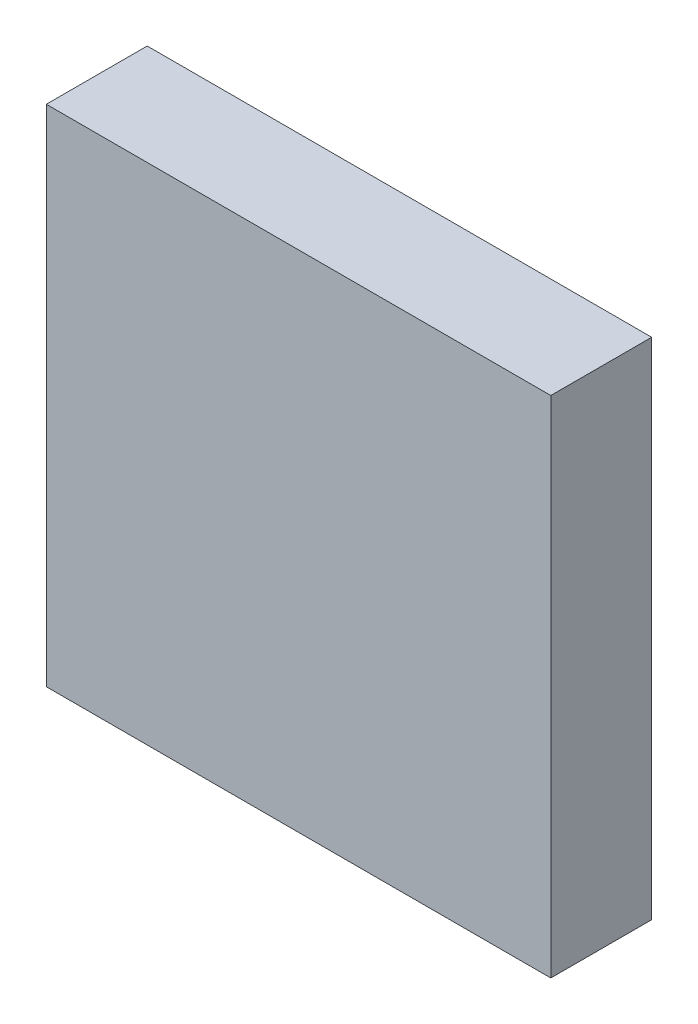
ISO-10303-21;
HEADER;
FILE_DESCRIPTION(('STEP AP214'),'2;1');
FILE_NAME('part.step','',(''),(''),'','','');
FILE_SCHEMA(('AUTOMOTIVE_DESIGN { 1 0 10303 214 1 1 1 1 }'));
ENDSEC;
DATA;
#1=APPLICATION_CONTEXT('core data for automotive mechanical design processes');
#2=APPLICATION_PROTOCOL_DEFINITION('international standard','automotive_design',2000,#1);
#3=PRODUCT_CONTEXT('',#1,'mechanical');
#4=PRODUCT('Part','Part','',(#3));
#5=PRODUCT_RELATED_PRODUCT_CATEGORY('part','',(#4));
#6=PRODUCT_DEFINITION_FORMATION('','',#4);
#7=PRODUCT_DEFINITION_CONTEXT('part definition',#1,'design');
#8=PRODUCT_DEFINITION('design','',#6,#7);
#9=PRODUCT_DEFINITION_SHAPE('','',#8);
#10=(LENGTH_UNIT() NAMED_UNIT(*) SI_UNIT(.MILLI.,.METRE.));
#11=(NAMED_UNIT(*) PLANE_ANGLE_UNIT() SI_UNIT($,.RADIAN.));
#12=(NAMED_UNIT(*) SI_UNIT($,.STERADIAN.) SOLID_ANGLE_UNIT());
#13=UNCERTAINTY_MEASURE_WITH_UNIT(LENGTH_MEASURE(1.E-05),#10,'distance_accuracy_value','');
#14=(GEOMETRIC_REPRESENTATION_CONTEXT(3) GLOBAL_UNCERTAINTY_ASSIGNED_CONTEXT((#13)) GLOBAL_UNIT_ASSIGNED_CONTEXT((#10,
#11,#12)) REPRESENTATION_CONTEXT('',''));
#15=CARTESIAN_POINT('',(0.,0.,0.));
#16=DIRECTION('',(0.,0.,1.));
#17=DIRECTION('',(1.,0.,0.));
#18=AXIS2_PLACEMENT_3D('',#15,#16,#17);
#19=CARTESIAN_POINT('',(0.,0.,5.));
#20=DIRECTION('',(1.,0.,0.));
#21=DIRECTION('',(0.,0.,-1.));
#22=AXIS2_PLACEMENT_3D('',#19,#20,#21);
#23=PLANE('',#22);
#24=DIRECTION('',(0.,-1.,0.));
#25=VECTOR('',#24,1.);
#26=CARTESIAN_POINT('',(0.,0.,0.));
#27=LINE('',#26,#25);
#28=CARTESIAN_POINT('',(0.,0.,0.));
#29=VERTEX_POINT('',#28);
#30=CARTESIAN_POINT('',(0.,-25.,0.));
#31=VERTEX_POINT('',#30);
#32=EDGE_CURVE('E96',#29,#31,#27,.T.);
#33=ORIENTED_EDGE('',*,*,#32,.T.);
#34=DIRECTION('',(0.,0.,-1.));
#35=VECTOR('',#34,1.);
#36=CARTESIAN_POINT('',(0.,-25.,5.));
#37=LINE('',#36,#35);
#38=CARTESIAN_POINT('',(0.,-25.,5.));
#39=VERTEX_POINT('',#38);
#40=EDGE_CURVE('E11',#39,#31,#37,.T.);
#41=ORIENTED_EDGE('',*,*,#40,.F.);
#42=DIRECTION('',(0.,-1.,0.));
#43=VECTOR('',#42,1.);
#44=CARTESIAN_POINT('',(0.,0.,5.));
#45=LINE('',#44,#43);
#46=CARTESIAN_POINT('',(0.,0.,5.));
#47=VERTEX_POINT('',#46);
#48=EDGE_CURVE('E84',#47,#39,#45,.T.);
#49=ORIENTED_EDGE('',*,*,#48,.F.);
#50=DIRECTION('',(0.,0.,-1.));
#51=VECTOR('',#50,1.);
#52=CARTESIAN_POINT('',(0.,0.,5.));
#53=LINE('',#52,#51);
#54=EDGE_CURVE('E92',#47,#29,#53,.T.);
#55=ORIENTED_EDGE('',*,*,#54,.T.);
#56=EDGE_LOOP('',(#33,#41,#49,#55));
#57=FACE_BOUND('',#56,.T.);
#58=ADVANCED_FACE('F33',(#57),#23,.F.);
#59=CARTESIAN_POINT('',(0.,-25.,5.));
#60=DIRECTION('',(0.,1.,0.));
#61=DIRECTION('',(0.,0.,1.));
#62=AXIS2_PLACEMENT_3D('',#59,#60,#61);
#63=PLANE('',#62);
#64=DIRECTION('',(1.,0.,0.));
#65=VECTOR('',#64,1.);
#66=CARTESIAN_POINT('',(0.,-25.,0.));
#67=LINE('',#66,#65);
#68=CARTESIAN_POINT('',(25.,-25.,0.));
#69=VERTEX_POINT('',#68);
#70=EDGE_CURVE('E88',#31,#69,#67,.T.);
#71=ORIENTED_EDGE('',*,*,#70,.T.);
#72=DIRECTION('',(0.,0.,-1.));
#73=VECTOR('',#72,1.);
#74=CARTESIAN_POINT('',(25.,-25.,5.));
#75=LINE('',#74,#73);
#76=CARTESIAN_POINT('',(25.,-25.,5.));
#77=VERTEX_POINT('',#76);
#78=EDGE_CURVE('E41',#77,#69,#75,.T.);
#79=ORIENTED_EDGE('',*,*,#78,.F.);
#80=DIRECTION('',(1.,0.,0.));
#81=VECTOR('',#80,1.);
#82=CARTESIAN_POINT('',(0.,-25.,5.));
#83=LINE('',#82,#81);
#84=EDGE_CURVE('E79',#39,#77,#83,.T.);
#85=ORIENTED_EDGE('',*,*,#84,.F.);
#86=ORIENTED_EDGE('',*,*,#40,.T.);
#87=EDGE_LOOP('',(#71,#79,#85,#86));
#88=FACE_BOUND('',#87,.T.);
#89=ADVANCED_FACE('F87',(#88),#63,.F.);
#90=CARTESIAN_POINT('',(25.,0.,5.));
#91=DIRECTION('',(-1.,0.,0.));
#92=DIRECTION('',(0.,0.,1.));
#93=AXIS2_PLACEMENT_3D('',#90,#91,#92);
#94=PLANE('',#93);
#95=DIRECTION('',(0.,1.,0.));
#96=VECTOR('',#95,1.);
#97=CARTESIAN_POINT('',(25.,0.,0.));
#98=LINE('',#97,#96);
#99=CARTESIAN_POINT('',(25.,0.,0.));
#100=VERTEX_POINT('',#99);
#101=EDGE_CURVE('E66',#69,#100,#98,.T.);
#102=ORIENTED_EDGE('',*,*,#101,.T.);
#103=DIRECTION('',(0.,0.,-1.));
#104=VECTOR('',#103,1.);
#105=CARTESIAN_POINT('',(25.,0.,5.));
#106=LINE('',#105,#104);
#107=CARTESIAN_POINT('',(25.,0.,5.));
#108=VERTEX_POINT('',#107);
#109=EDGE_CURVE('E89',#108,#100,#106,.T.);
#110=ORIENTED_EDGE('',*,*,#109,.F.);
#111=DIRECTION('',(0.,1.,0.));
#112=VECTOR('',#111,1.);
#113=CARTESIAN_POINT('',(25.,0.,5.));
#114=LINE('',#113,#112);
#115=EDGE_CURVE('E82',#77,#108,#114,.T.);
#116=ORIENTED_EDGE('',*,*,#115,.F.);
#117=ORIENTED_EDGE('',*,*,#78,.T.);
#118=EDGE_LOOP('',(#102,#110,#116,#117));
#119=FACE_BOUND('',#118,.T.);
#120=ADVANCED_FACE('F90',(#119),#94,.F.);
#121=CARTESIAN_POINT('',(0.,0.,5.));
#122=DIRECTION('',(0.,-1.,0.));
#123=DIRECTION('',(0.,0.,-1.));
#124=AXIS2_PLACEMENT_3D('',#121,#122,#123);
#125=PLANE('',#124);
#126=DIRECTION('',(-1.,0.,0.));
#127=VECTOR('',#126,1.);
#128=CARTESIAN_POINT('',(0.,0.,0.));
#129=LINE('',#128,#127);
#130=EDGE_CURVE('E72',#100,#29,#129,.T.);
#131=ORIENTED_EDGE('',*,*,#130,.T.);
#132=ORIENTED_EDGE('',*,*,#54,.F.);
#133=DIRECTION('',(-1.,0.,0.));
#134=VECTOR('',#133,1.);
#135=CARTESIAN_POINT('',(0.,0.,5.));
#136=LINE('',#135,#134);
#137=EDGE_CURVE('E49',#108,#47,#136,.T.);
#138=ORIENTED_EDGE('',*,*,#137,.F.);
#139=ORIENTED_EDGE('',*,*,#109,.T.);
#140=EDGE_LOOP('',(#131,#132,#138,#139));
#141=FACE_BOUND('',#140,.T.);
#142=ADVANCED_FACE('F103',(#141),#125,.F.);
#143=CARTESIAN_POINT('',(0.,0.,5.));
#144=DIRECTION('',(0.,0.,1.));
#145=DIRECTION('',(1.,0.,0.));
#146=AXIS2_PLACEMENT_3D('',#143,#144,#145);
#147=PLANE('',#146);
#148=ORIENTED_EDGE('',*,*,#48,.T.);
#149=ORIENTED_EDGE('',*,*,#84,.T.);
#150=ORIENTED_EDGE('',*,*,#115,.T.);
#151=ORIENTED_EDGE('',*,*,#137,.T.);
#152=EDGE_LOOP('',(#148,#149,#150,#151));
#153=FACE_BOUND('',#152,.T.);
#154=ADVANCED_FACE('F80',(#153),#147,.T.);
#155=CARTESIAN_POINT('',(0.,0.,0.));
#156=DIRECTION('',(0.,0.,1.));
#157=DIRECTION('',(1.,0.,0.));
#158=AXIS2_PLACEMENT_3D('',#155,#156,#157);
#159=PLANE('',#158);
#160=ORIENTED_EDGE('',*,*,#32,.F.);
#161=ORIENTED_EDGE('',*,*,#130,.F.);
#162=ORIENTED_EDGE('',*,*,#101,.F.);
#163=ORIENTED_EDGE('',*,*,#70,.F.);
#164=EDGE_LOOP('',(#160,#161,#162,#163));
#165=FACE_BOUND('',#164,.T.);
#166=ADVANCED_FACE('F106',(#165),#159,.F.);
#167=CLOSED_SHELL('',(#58,#89,#120,#142,#154,#166));
#168=MANIFOLD_SOLID_BREP('B2',#167);
#169=ADVANCED_BREP_SHAPE_REPRESENTATION('',(#18,#168),#14);
#170=SHAPE_DEFINITION_REPRESENTATION(#9,#169);
ENDSEC;
END-ISO-10303-21;
